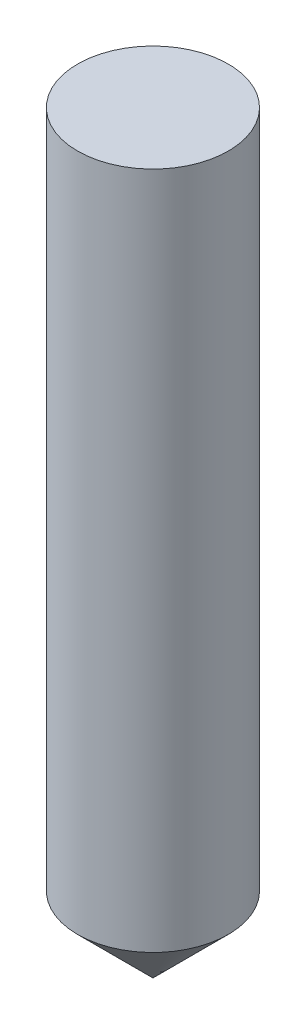
ISO-10303-21;
HEADER;
FILE_DESCRIPTION(('STEP AP214'),'2;1');
FILE_NAME('part.step','',(''),(''),'','','');
FILE_SCHEMA(('AUTOMOTIVE_DESIGN { 1 0 10303 214 1 1 1 1 }'));
ENDSEC;
DATA;
#1=APPLICATION_CONTEXT('core data for automotive mechanical design processes');
#2=APPLICATION_PROTOCOL_DEFINITION('international standard','automotive_design',2000,#1);
#3=PRODUCT_CONTEXT('',#1,'mechanical');
#4=PRODUCT('Part','Part','',(#3));
#5=PRODUCT_RELATED_PRODUCT_CATEGORY('part','',(#4));
#6=PRODUCT_DEFINITION_FORMATION('','',#4);
#7=PRODUCT_DEFINITION_CONTEXT('part definition',#1,'design');
#8=PRODUCT_DEFINITION('design','',#6,#7);
#9=PRODUCT_DEFINITION_SHAPE('','',#8);
#10=(LENGTH_UNIT() NAMED_UNIT(*) SI_UNIT(.MILLI.,.METRE.));
#11=(NAMED_UNIT(*) PLANE_ANGLE_UNIT() SI_UNIT($,.RADIAN.));
#12=(NAMED_UNIT(*) SI_UNIT($,.STERADIAN.) SOLID_ANGLE_UNIT());
#13=UNCERTAINTY_MEASURE_WITH_UNIT(LENGTH_MEASURE(1.E-05),#10,'distance_accuracy_value','');
#14=(GEOMETRIC_REPRESENTATION_CONTEXT(3) GLOBAL_UNCERTAINTY_ASSIGNED_CONTEXT((#13)) GLOBAL_UNIT_ASSIGNED_CONTEXT((#10,
#11,#12)) REPRESENTATION_CONTEXT('',''));
#15=CARTESIAN_POINT('',(0.,0.,0.));
#16=DIRECTION('',(0.,0.,1.));
#17=DIRECTION('',(1.,0.,0.));
#18=AXIS2_PLACEMENT_3D('',#15,#16,#17);
#19=CARTESIAN_POINT('',(0.,50.,0.));
#20=DIRECTION('',(0.,-1.,0.));
#21=DIRECTION('',(0.,0.,-1.));
#22=AXIS2_PLACEMENT_3D('',#19,#20,#21);
#23=CYLINDRICAL_SURFACE('',#22,5.);
#24=CARTESIAN_POINT('',(0.,5.,0.));
#25=DIRECTION('',(0.,1.,0.));
#26=DIRECTION('',(0.,0.,1.));
#27=AXIS2_PLACEMENT_3D('',#24,#25,#26);
#28=CIRCLE('',#27,5.);
#29=CARTESIAN_POINT('',(0.,5.,5.));
#30=VERTEX_POINT('',#29);
#31=EDGE_CURVE('E11',#30,#30,#28,.T.);
#32=ORIENTED_EDGE('',*,*,#31,.T.);
#33=EDGE_LOOP('',(#32));
#34=FACE_BOUND('',#33,.T.);
#35=CARTESIAN_POINT('',(0.,50.,0.));
#36=DIRECTION('',(0.,1.,0.));
#37=DIRECTION('',(0.,0.,1.));
#38=AXIS2_PLACEMENT_3D('',#35,#36,#37);
#39=CIRCLE('',#38,5.);
#40=CARTESIAN_POINT('',(0.,50.,5.));
#41=VERTEX_POINT('',#40);
#42=EDGE_CURVE('E48',#41,#41,#39,.T.);
#43=ORIENTED_EDGE('',*,*,#42,.F.);
#44=EDGE_LOOP('',(#43));
#45=FACE_BOUND('',#44,.T.);
#46=ADVANCED_FACE('F40',(#34,#45),#23,.T.);
#47=CARTESIAN_POINT('',(0.,50.,0.));
#48=DIRECTION('',(0.,1.,0.));
#49=DIRECTION('',(0.,0.,1.));
#50=AXIS2_PLACEMENT_3D('',#47,#48,#49);
#51=PLANE('',#50);
#52=ORIENTED_EDGE('',*,*,#42,.T.);
#53=EDGE_LOOP('',(#52));
#54=FACE_BOUND('',#53,.T.);
#55=ADVANCED_FACE('F53',(#54),#51,.T.);
#56=CARTESIAN_POINT('',(0.,5.,0.));
#57=DIRECTION('',(0.,1.,0.));
#58=DIRECTION('',(0.,0.,1.));
#59=AXIS2_PLACEMENT_3D('',#56,#57,#58);
#60=CONICAL_SURFACE('',#59,5.00000000000002,0.78539816339745);
#61=CARTESIAN_POINT('',(0.,0.,0.));
#62=VERTEX_POINT('',#61);
#63=VERTEX_LOOP('',#62);
#64=FACE_BOUND('',#63,.T.);
#65=ORIENTED_EDGE('',*,*,#31,.F.);
#66=EDGE_LOOP('',(#65));
#67=FACE_BOUND('',#66,.T.);
#68=ADVANCED_FACE('F43',(#64,#67),#60,.T.);
#69=CLOSED_SHELL('',(#46,#55,#68));
#70=MANIFOLD_SOLID_BREP('B2',#69);
#71=ADVANCED_BREP_SHAPE_REPRESENTATION('',(#18,#70),#14);
#72=SHAPE_DEFINITION_REPRESENTATION(#9,#71);
ENDSEC;
END-ISO-10303-21;
